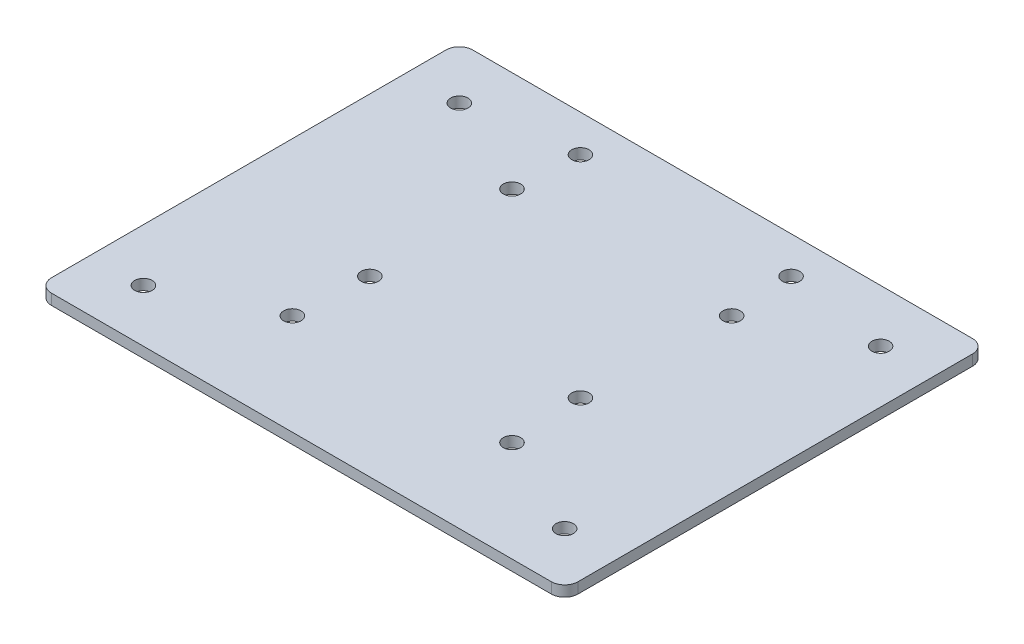
ISO-10303-21;
HEADER;
FILE_DESCRIPTION(('STEP AP214'),'2;1');
FILE_NAME('part.step','',(''),(''),'','','');
FILE_SCHEMA(('AUTOMOTIVE_DESIGN { 1 0 10303 214 1 1 1 1 }'));
ENDSEC;
DATA;
#1=APPLICATION_CONTEXT('core data for automotive mechanical design processes');
#2=APPLICATION_PROTOCOL_DEFINITION('international standard','automotive_design',2000,#1);
#3=PRODUCT_CONTEXT('',#1,'mechanical');
#4=PRODUCT('Part','Part','',(#3));
#5=PRODUCT_RELATED_PRODUCT_CATEGORY('part','',(#4));
#6=PRODUCT_DEFINITION_FORMATION('','',#4);
#7=PRODUCT_DEFINITION_CONTEXT('part definition',#1,'design');
#8=PRODUCT_DEFINITION('design','',#6,#7);
#9=PRODUCT_DEFINITION_SHAPE('','',#8);
#10=(LENGTH_UNIT() NAMED_UNIT(*) SI_UNIT(.MILLI.,.METRE.));
#11=(NAMED_UNIT(*) PLANE_ANGLE_UNIT() SI_UNIT($,.RADIAN.));
#12=(NAMED_UNIT(*) SI_UNIT($,.STERADIAN.) SOLID_ANGLE_UNIT());
#13=UNCERTAINTY_MEASURE_WITH_UNIT(LENGTH_MEASURE(1.E-05),#10,'distance_accuracy_value','');
#14=(GEOMETRIC_REPRESENTATION_CONTEXT(3) GLOBAL_UNCERTAINTY_ASSIGNED_CONTEXT((#13)) GLOBAL_UNIT_ASSIGNED_CONTEXT((#10,
#11,#12)) REPRESENTATION_CONTEXT('',''));
#15=CARTESIAN_POINT('',(0.,0.,0.));
#16=DIRECTION('',(0.,0.,1.));
#17=DIRECTION('',(1.,0.,0.));
#18=AXIS2_PLACEMENT_3D('',#15,#16,#17);
#19=CARTESIAN_POINT('',(0.,2.032,0.));
#20=DIRECTION('',(0.,1.,0.));
#21=DIRECTION('',(0.,0.,1.));
#22=AXIS2_PLACEMENT_3D('',#19,#20,#21);
#23=PLANE('',#22);
#24=CARTESIAN_POINT('',(-17.3902622899012,2.032,32.390262289901));
#25=DIRECTION('',(0.,1.,0.));
#26=DIRECTION('',(0.,0.,1.));
#27=AXIS2_PLACEMENT_3D('',#24,#25,#26);
#28=CIRCLE('',#27,1.651);
#29=CARTESIAN_POINT('',(-17.3902622899012,2.032,34.041262289901));
#30=VERTEX_POINT('',#29);
#31=EDGE_CURVE('E245',#30,#30,#28,.T.);
#32=ORIENTED_EDGE('',*,*,#31,.F.);
#33=EDGE_LOOP('',(#32));
#34=FACE_BOUND('',#33,.T.);
#35=CARTESIAN_POINT('',(43.4693877551021,2.032,41.530612244898));
#36=DIRECTION('',(0.,1.,0.));
#37=DIRECTION('',(0.,0.,-1.));
#38=AXIS2_PLACEMENT_3D('',#35,#36,#37);
#39=CIRCLE('',#38,1.651);
#40=CARTESIAN_POINT('',(43.4693877551021,2.032,39.879612244898));
#41=VERTEX_POINT('',#40);
#42=EDGE_CURVE('E233',#41,#41,#39,.T.);
#43=ORIENTED_EDGE('',*,*,#42,.F.);
#44=EDGE_LOOP('',(#43));
#45=FACE_BOUND('',#44,.T.);
#46=CARTESIAN_POINT('',(-17.390262289901,2.032,-9.32903780010529));
#47=DIRECTION('',(0.,1.,0.));
#48=DIRECTION('',(0.,0.,1.));
#49=AXIS2_PLACEMENT_3D('',#46,#47,#48);
#50=CIRCLE('',#49,1.651);
#51=CARTESIAN_POINT('',(-17.390262289901,2.032,-7.67803780010529));
#52=VERTEX_POINT('',#51);
#53=EDGE_CURVE('E221',#52,#52,#50,.T.);
#54=ORIENTED_EDGE('',*,*,#53,.F.);
#55=EDGE_LOOP('',(#54));
#56=FACE_BOUND('',#55,.T.);
#57=CARTESIAN_POINT('',(-16.5306122448979,2.032,18.530612244898));
#58=DIRECTION('',(0.,1.,0.));
#59=DIRECTION('',(0.,0.,1.));
#60=AXIS2_PLACEMENT_3D('',#57,#58,#59);
#61=CIRCLE('',#60,1.651);
#62=CARTESIAN_POINT('',(-16.5306122448979,2.032,20.181612244898));
#63=VERTEX_POINT('',#62);
#64=EDGE_CURVE('E209',#63,#63,#61,.T.);
#65=ORIENTED_EDGE('',*,*,#64,.F.);
#66=EDGE_LOOP('',(#65));
#67=FACE_BOUND('',#66,.T.);
#68=CARTESIAN_POINT('',(-16.5306122448979,2.032,-21.469387755102));
#69=DIRECTION('',(0.,1.,0.));
#70=DIRECTION('',(0.,0.,1.));
#71=AXIS2_PLACEMENT_3D('',#68,#69,#70);
#72=CIRCLE('',#71,1.651);
#73=CARTESIAN_POINT('',(-16.5306122448979,2.032,-19.818387755102));
#74=VERTEX_POINT('',#73);
#75=EDGE_CURVE('E197',#74,#74,#72,.T.);
#76=ORIENTED_EDGE('',*,*,#75,.F.);
#77=EDGE_LOOP('',(#76));
#78=FACE_BOUND('',#77,.T.);
#79=CARTESIAN_POINT('',(-36.5306122448979,2.032,-18.469387755102));
#80=DIRECTION('',(0.,1.,0.));
#81=DIRECTION('',(0.,0.,1.));
#82=AXIS2_PLACEMENT_3D('',#79,#80,#81);
#83=CIRCLE('',#82,1.651);
#84=CARTESIAN_POINT('',(-36.5306122448979,2.032,-16.818387755102));
#85=VERTEX_POINT('',#84);
#86=EDGE_CURVE('E139',#85,#85,#83,.T.);
#87=ORIENTED_EDGE('',*,*,#86,.F.);
#88=EDGE_LOOP('',(#87));
#89=FACE_BOUND('',#88,.T.);
#90=DIRECTION('',(-1.,0.,0.));
#91=VECTOR('',#90,1.);
#92=CARTESIAN_POINT('',(-46.5306122448979,2.032,-28.469387755102));
#93=LINE('',#92,#91);
#94=CARTESIAN_POINT('',(50.9293877551021,2.032,-28.469387755102));
#95=VERTEX_POINT('',#94);
#96=CARTESIAN_POINT('',(-43.9906122448979,2.032,-28.469387755102));
#97=VERTEX_POINT('',#96);
#98=EDGE_CURVE('E128',#95,#97,#93,.T.);
#99=ORIENTED_EDGE('',*,*,#98,.T.);
#100=CARTESIAN_POINT('',(-43.9906122448979,2.032,-25.929387755102));
#101=DIRECTION('',(0.,1.,0.));
#102=DIRECTION('',(0.,0.,1.));
#103=AXIS2_PLACEMENT_3D('',#100,#101,#102);
#104=CIRCLE('',#103,2.54);
#105=CARTESIAN_POINT('',(-46.5306122448979,2.032,-25.929387755102));
#106=VERTEX_POINT('',#105);
#107=EDGE_CURVE('E165',#97,#106,#104,.T.);
#108=ORIENTED_EDGE('',*,*,#107,.T.);
#109=DIRECTION('',(0.,0.,1.));
#110=VECTOR('',#109,1.);
#111=CARTESIAN_POINT('',(-46.5306122448979,2.032,-28.469387755102));
#112=LINE('',#111,#110);
#113=CARTESIAN_POINT('',(-46.5306122448979,2.032,48.990612244898));
#114=VERTEX_POINT('',#113);
#115=EDGE_CURVE('E144',#106,#114,#112,.T.);
#116=ORIENTED_EDGE('',*,*,#115,.T.);
#117=CARTESIAN_POINT('',(-43.9906122448979,2.032,48.990612244898));
#118=DIRECTION('',(0.,1.,0.));
#119=DIRECTION('',(0.,0.,1.));
#120=AXIS2_PLACEMENT_3D('',#117,#118,#119);
#121=CIRCLE('',#120,2.54);
#122=CARTESIAN_POINT('',(-43.9906122448979,2.032,51.530612244898));
#123=VERTEX_POINT('',#122);
#124=EDGE_CURVE('E147',#114,#123,#121,.T.);
#125=ORIENTED_EDGE('',*,*,#124,.T.);
#126=DIRECTION('',(1.,0.,0.));
#127=VECTOR('',#126,1.);
#128=CARTESIAN_POINT('',(-46.5306122448979,2.032,51.530612244898));
#129=LINE('',#128,#127);
#130=CARTESIAN_POINT('',(50.9293877551021,2.032,51.530612244898));
#131=VERTEX_POINT('',#130);
#132=EDGE_CURVE('E127',#123,#131,#129,.T.);
#133=ORIENTED_EDGE('',*,*,#132,.T.);
#134=CARTESIAN_POINT('',(50.9293877551021,2.032,48.990612244898));
#135=DIRECTION('',(0.,1.,0.));
#136=DIRECTION('',(0.,0.,1.));
#137=AXIS2_PLACEMENT_3D('',#134,#135,#136);
#138=CIRCLE('',#137,2.54);
#139=CARTESIAN_POINT('',(53.4693877551021,2.032,48.990612244898));
#140=VERTEX_POINT('',#139);
#141=EDGE_CURVE('E65',#131,#140,#138,.T.);
#142=ORIENTED_EDGE('',*,*,#141,.T.);
#143=DIRECTION('',(0.,0.,-1.));
#144=VECTOR('',#143,1.);
#145=CARTESIAN_POINT('',(53.4693877551021,2.032,-28.469387755102));
#146=LINE('',#145,#144);
#147=CARTESIAN_POINT('',(53.4693877551021,2.032,-25.929387755102));
#148=VERTEX_POINT('',#147);
#149=EDGE_CURVE('E171',#140,#148,#146,.T.);
#150=ORIENTED_EDGE('',*,*,#149,.T.);
#151=CARTESIAN_POINT('',(50.9293877551021,2.032,-25.929387755102));
#152=DIRECTION('',(0.,1.,0.));
#153=DIRECTION('',(0.,0.,1.));
#154=AXIS2_PLACEMENT_3D('',#151,#152,#153);
#155=CIRCLE('',#154,2.54);
#156=EDGE_CURVE('E163',#148,#95,#155,.T.);
#157=ORIENTED_EDGE('',*,*,#156,.T.);
#158=EDGE_LOOP('',(#99,#108,#116,#125,#133,#142,#150,#157));
#159=FACE_BOUND('',#158,.T.);
#160=CARTESIAN_POINT('',(-36.5306122448979,2.032,41.530612244898));
#161=DIRECTION('',(0.,1.,0.));
#162=DIRECTION('',(0.,0.,1.));
#163=AXIS2_PLACEMENT_3D('',#160,#161,#162);
#164=CIRCLE('',#163,1.651);
#165=CARTESIAN_POINT('',(-36.5306122448979,2.032,43.181612244898));
#166=VERTEX_POINT('',#165);
#167=EDGE_CURVE('E191',#166,#166,#164,.T.);
#168=ORIENTED_EDGE('',*,*,#167,.F.);
#169=EDGE_LOOP('',(#168));
#170=FACE_BOUND('',#169,.T.);
#171=CARTESIAN_POINT('',(23.4693877551021,2.032,-21.469387755102));
#172=DIRECTION('',(0.,1.,0.));
#173=DIRECTION('',(0.,0.,1.));
#174=AXIS2_PLACEMENT_3D('',#171,#172,#173);
#175=CIRCLE('',#174,1.651);
#176=CARTESIAN_POINT('',(23.4693877551021,2.032,-19.818387755102));
#177=VERTEX_POINT('',#176);
#178=EDGE_CURVE('E203',#177,#177,#175,.T.);
#179=ORIENTED_EDGE('',*,*,#178,.F.);
#180=EDGE_LOOP('',(#179));
#181=FACE_BOUND('',#180,.T.);
#182=CARTESIAN_POINT('',(23.4693877551021,2.032,18.530612244898));
#183=DIRECTION('',(0.,1.,0.));
#184=DIRECTION('',(0.,0.,1.));
#185=AXIS2_PLACEMENT_3D('',#182,#183,#184);
#186=CIRCLE('',#185,1.651);
#187=CARTESIAN_POINT('',(23.4693877551021,2.032,20.181612244898));
#188=VERTEX_POINT('',#187);
#189=EDGE_CURVE('E215',#188,#188,#186,.T.);
#190=ORIENTED_EDGE('',*,*,#189,.F.);
#191=EDGE_LOOP('',(#190));
#192=FACE_BOUND('',#191,.T.);
#193=CARTESIAN_POINT('',(24.3290378001052,2.032,-9.32903780010523));
#194=DIRECTION('',(0.,1.,0.));
#195=DIRECTION('',(0.,0.,1.));
#196=AXIS2_PLACEMENT_3D('',#193,#194,#195);
#197=CIRCLE('',#196,1.651);
#198=CARTESIAN_POINT('',(24.3290378001052,2.032,-7.67803780010523));
#199=VERTEX_POINT('',#198);
#200=EDGE_CURVE('E227',#199,#199,#197,.T.);
#201=ORIENTED_EDGE('',*,*,#200,.F.);
#202=EDGE_LOOP('',(#201));
#203=FACE_BOUND('',#202,.T.);
#204=CARTESIAN_POINT('',(43.4693877551021,2.032,-18.469387755102));
#205=DIRECTION('',(0.,1.,0.));
#206=DIRECTION('',(0.,0.,-1.));
#207=AXIS2_PLACEMENT_3D('',#204,#205,#206);
#208=CIRCLE('',#207,1.651);
#209=CARTESIAN_POINT('',(43.4693877551021,2.032,-20.120387755102));
#210=VERTEX_POINT('',#209);
#211=EDGE_CURVE('E239',#210,#210,#208,.T.);
#212=ORIENTED_EDGE('',*,*,#211,.F.);
#213=EDGE_LOOP('',(#212));
#214=FACE_BOUND('',#213,.T.);
#215=CARTESIAN_POINT('',(24.3290378001053,2.032,32.3902622899011));
#216=DIRECTION('',(0.,1.,0.));
#217=DIRECTION('',(0.,0.,1.));
#218=AXIS2_PLACEMENT_3D('',#215,#216,#217);
#219=CIRCLE('',#218,1.65100000000001);
#220=CARTESIAN_POINT('',(24.3290378001053,2.032,34.0412622899011));
#221=VERTEX_POINT('',#220);
#222=EDGE_CURVE('E251',#221,#221,#219,.T.);
#223=ORIENTED_EDGE('',*,*,#222,.F.);
#224=EDGE_LOOP('',(#223));
#225=FACE_BOUND('',#224,.T.);
#226=ADVANCED_FACE('F44',(#34,#45,#56,#67,#78,#89,#159,#170,#181,#192,#203,#214,#225),#23,.T.);
#227=CARTESIAN_POINT('',(0.,0.,0.));
#228=DIRECTION('',(0.,1.,0.));
#229=DIRECTION('',(0.,0.,1.));
#230=AXIS2_PLACEMENT_3D('',#227,#228,#229);
#231=PLANE('',#230);
#232=DIRECTION('',(0.,0.,1.));
#233=VECTOR('',#232,1.);
#234=CARTESIAN_POINT('',(-46.5306122448979,0.,-28.469387755102));
#235=LINE('',#234,#233);
#236=CARTESIAN_POINT('',(-46.5306122448979,0.,-25.929387755102));
#237=VERTEX_POINT('',#236);
#238=CARTESIAN_POINT('',(-46.5306122448979,0.,48.990612244898));
#239=VERTEX_POINT('',#238);
#240=EDGE_CURVE('E135',#237,#239,#235,.T.);
#241=ORIENTED_EDGE('',*,*,#240,.F.);
#242=CARTESIAN_POINT('',(-43.9906122448979,0.,-25.929387755102));
#243=DIRECTION('',(0.,1.,0.));
#244=DIRECTION('',(0.,0.,1.));
#245=AXIS2_PLACEMENT_3D('',#242,#243,#244);
#246=CIRCLE('',#245,2.54);
#247=CARTESIAN_POINT('',(-43.9906122448979,0.,-28.469387755102));
#248=VERTEX_POINT('',#247);
#249=EDGE_CURVE('E155',#237,#248,#246,.F.);
#250=ORIENTED_EDGE('',*,*,#249,.T.);
#251=DIRECTION('',(-1.,0.,0.));
#252=VECTOR('',#251,1.);
#253=CARTESIAN_POINT('',(-46.5306122448979,0.,-28.469387755102));
#254=LINE('',#253,#252);
#255=CARTESIAN_POINT('',(50.9293877551021,0.,-28.469387755102));
#256=VERTEX_POINT('',#255);
#257=EDGE_CURVE('E137',#256,#248,#254,.T.);
#258=ORIENTED_EDGE('',*,*,#257,.F.);
#259=CARTESIAN_POINT('',(50.9293877551021,0.,-25.929387755102));
#260=DIRECTION('',(0.,1.,0.));
#261=DIRECTION('',(0.,0.,1.));
#262=AXIS2_PLACEMENT_3D('',#259,#260,#261);
#263=CIRCLE('',#262,2.54);
#264=CARTESIAN_POINT('',(53.4693877551021,0.,-25.929387755102));
#265=VERTEX_POINT('',#264);
#266=EDGE_CURVE('E153',#256,#265,#263,.F.);
#267=ORIENTED_EDGE('',*,*,#266,.T.);
#268=DIRECTION('',(0.,0.,-1.));
#269=VECTOR('',#268,1.);
#270=CARTESIAN_POINT('',(53.4693877551021,0.,-28.469387755102));
#271=LINE('',#270,#269);
#272=CARTESIAN_POINT('',(53.4693877551021,0.,48.990612244898));
#273=VERTEX_POINT('',#272);
#274=EDGE_CURVE('E134',#273,#265,#271,.T.);
#275=ORIENTED_EDGE('',*,*,#274,.F.);
#276=CARTESIAN_POINT('',(50.9293877551021,0.,48.990612244898));
#277=DIRECTION('',(0.,1.,0.));
#278=DIRECTION('',(0.,0.,1.));
#279=AXIS2_PLACEMENT_3D('',#276,#277,#278);
#280=CIRCLE('',#279,2.54);
#281=CARTESIAN_POINT('',(50.9293877551021,0.,51.530612244898));
#282=VERTEX_POINT('',#281);
#283=EDGE_CURVE('E133',#273,#282,#280,.F.);
#284=ORIENTED_EDGE('',*,*,#283,.T.);
#285=DIRECTION('',(1.,0.,0.));
#286=VECTOR('',#285,1.);
#287=CARTESIAN_POINT('',(-46.5306122448979,0.,51.530612244898));
#288=LINE('',#287,#286);
#289=CARTESIAN_POINT('',(-43.9906122448979,0.,51.530612244898));
#290=VERTEX_POINT('',#289);
#291=EDGE_CURVE('E125',#290,#282,#288,.T.);
#292=ORIENTED_EDGE('',*,*,#291,.F.);
#293=CARTESIAN_POINT('',(-43.9906122448979,0.,48.990612244898));
#294=DIRECTION('',(0.,1.,0.));
#295=DIRECTION('',(0.,0.,1.));
#296=AXIS2_PLACEMENT_3D('',#293,#294,#295);
#297=CIRCLE('',#296,2.54);
#298=EDGE_CURVE('E110',#290,#239,#297,.F.);
#299=ORIENTED_EDGE('',*,*,#298,.T.);
#300=EDGE_LOOP('',(#241,#250,#258,#267,#275,#284,#292,#299));
#301=FACE_BOUND('',#300,.T.);
#302=CARTESIAN_POINT('',(-36.5306122448979,0.,-18.469387755102));
#303=DIRECTION('',(0.,1.,0.));
#304=DIRECTION('',(0.,0.,1.));
#305=AXIS2_PLACEMENT_3D('',#302,#303,#304);
#306=CIRCLE('',#305,1.651);
#307=CARTESIAN_POINT('',(-36.5306122448979,0.,-16.818387755102));
#308=VERTEX_POINT('',#307);
#309=EDGE_CURVE('E188',#308,#308,#306,.T.);
#310=ORIENTED_EDGE('',*,*,#309,.T.);
#311=EDGE_LOOP('',(#310));
#312=FACE_BOUND('',#311,.T.);
#313=CARTESIAN_POINT('',(-36.5306122448979,0.,41.530612244898));
#314=DIRECTION('',(0.,1.,0.));
#315=DIRECTION('',(0.,0.,1.));
#316=AXIS2_PLACEMENT_3D('',#313,#314,#315);
#317=CIRCLE('',#316,1.651);
#318=CARTESIAN_POINT('',(-36.5306122448979,0.,43.181612244898));
#319=VERTEX_POINT('',#318);
#320=EDGE_CURVE('E194',#319,#319,#317,.T.);
#321=ORIENTED_EDGE('',*,*,#320,.T.);
#322=EDGE_LOOP('',(#321));
#323=FACE_BOUND('',#322,.T.);
#324=CARTESIAN_POINT('',(-16.5306122448979,0.,-21.469387755102));
#325=DIRECTION('',(0.,1.,0.));
#326=DIRECTION('',(0.,0.,1.));
#327=AXIS2_PLACEMENT_3D('',#324,#325,#326);
#328=CIRCLE('',#327,1.651);
#329=CARTESIAN_POINT('',(-16.5306122448979,0.,-19.818387755102));
#330=VERTEX_POINT('',#329);
#331=EDGE_CURVE('E200',#330,#330,#328,.T.);
#332=ORIENTED_EDGE('',*,*,#331,.T.);
#333=EDGE_LOOP('',(#332));
#334=FACE_BOUND('',#333,.T.);
#335=CARTESIAN_POINT('',(23.4693877551021,0.,-21.469387755102));
#336=DIRECTION('',(0.,1.,0.));
#337=DIRECTION('',(0.,0.,1.));
#338=AXIS2_PLACEMENT_3D('',#335,#336,#337);
#339=CIRCLE('',#338,1.651);
#340=CARTESIAN_POINT('',(23.4693877551021,0.,-19.818387755102));
#341=VERTEX_POINT('',#340);
#342=EDGE_CURVE('E206',#341,#341,#339,.T.);
#343=ORIENTED_EDGE('',*,*,#342,.T.);
#344=EDGE_LOOP('',(#343));
#345=FACE_BOUND('',#344,.T.);
#346=CARTESIAN_POINT('',(-16.5306122448979,0.,18.530612244898));
#347=DIRECTION('',(0.,1.,0.));
#348=DIRECTION('',(0.,0.,1.));
#349=AXIS2_PLACEMENT_3D('',#346,#347,#348);
#350=CIRCLE('',#349,1.651);
#351=CARTESIAN_POINT('',(-16.5306122448979,0.,20.181612244898));
#352=VERTEX_POINT('',#351);
#353=EDGE_CURVE('E212',#352,#352,#350,.T.);
#354=ORIENTED_EDGE('',*,*,#353,.T.);
#355=EDGE_LOOP('',(#354));
#356=FACE_BOUND('',#355,.T.);
#357=CARTESIAN_POINT('',(23.4693877551021,0.,18.530612244898));
#358=DIRECTION('',(0.,1.,0.));
#359=DIRECTION('',(0.,0.,1.));
#360=AXIS2_PLACEMENT_3D('',#357,#358,#359);
#361=CIRCLE('',#360,1.651);
#362=CARTESIAN_POINT('',(23.4693877551021,0.,20.181612244898));
#363=VERTEX_POINT('',#362);
#364=EDGE_CURVE('E218',#363,#363,#361,.T.);
#365=ORIENTED_EDGE('',*,*,#364,.T.);
#366=EDGE_LOOP('',(#365));
#367=FACE_BOUND('',#366,.T.);
#368=CARTESIAN_POINT('',(-17.390262289901,0.,-9.32903780010529));
#369=DIRECTION('',(0.,1.,0.));
#370=DIRECTION('',(0.,0.,1.));
#371=AXIS2_PLACEMENT_3D('',#368,#369,#370);
#372=CIRCLE('',#371,1.651);
#373=CARTESIAN_POINT('',(-17.390262289901,0.,-7.67803780010529));
#374=VERTEX_POINT('',#373);
#375=EDGE_CURVE('E224',#374,#374,#372,.T.);
#376=ORIENTED_EDGE('',*,*,#375,.T.);
#377=EDGE_LOOP('',(#376));
#378=FACE_BOUND('',#377,.T.);
#379=CARTESIAN_POINT('',(24.3290378001052,0.,-9.32903780010523));
#380=DIRECTION('',(0.,1.,0.));
#381=DIRECTION('',(0.,0.,1.));
#382=AXIS2_PLACEMENT_3D('',#379,#380,#381);
#383=CIRCLE('',#382,1.651);
#384=CARTESIAN_POINT('',(24.3290378001052,0.,-7.67803780010523));
#385=VERTEX_POINT('',#384);
#386=EDGE_CURVE('E230',#385,#385,#383,.T.);
#387=ORIENTED_EDGE('',*,*,#386,.T.);
#388=EDGE_LOOP('',(#387));
#389=FACE_BOUND('',#388,.T.);
#390=CARTESIAN_POINT('',(43.4693877551021,0.,41.530612244898));
#391=DIRECTION('',(0.,1.,0.));
#392=DIRECTION('',(0.,0.,-1.));
#393=AXIS2_PLACEMENT_3D('',#390,#391,#392);
#394=CIRCLE('',#393,1.651);
#395=CARTESIAN_POINT('',(43.4693877551021,0.,39.879612244898));
#396=VERTEX_POINT('',#395);
#397=EDGE_CURVE('E236',#396,#396,#394,.T.);
#398=ORIENTED_EDGE('',*,*,#397,.T.);
#399=EDGE_LOOP('',(#398));
#400=FACE_BOUND('',#399,.T.);
#401=CARTESIAN_POINT('',(43.4693877551021,0.,-18.469387755102));
#402=DIRECTION('',(0.,1.,0.));
#403=DIRECTION('',(0.,0.,-1.));
#404=AXIS2_PLACEMENT_3D('',#401,#402,#403);
#405=CIRCLE('',#404,1.651);
#406=CARTESIAN_POINT('',(43.4693877551021,0.,-20.120387755102));
#407=VERTEX_POINT('',#406);
#408=EDGE_CURVE('E242',#407,#407,#405,.T.);
#409=ORIENTED_EDGE('',*,*,#408,.T.);
#410=EDGE_LOOP('',(#409));
#411=FACE_BOUND('',#410,.T.);
#412=CARTESIAN_POINT('',(-17.3902622899012,0.,32.390262289901));
#413=DIRECTION('',(0.,1.,0.));
#414=DIRECTION('',(0.,0.,1.));
#415=AXIS2_PLACEMENT_3D('',#412,#413,#414);
#416=CIRCLE('',#415,1.651);
#417=CARTESIAN_POINT('',(-17.3902622899012,0.,34.041262289901));
#418=VERTEX_POINT('',#417);
#419=EDGE_CURVE('E248',#418,#418,#416,.T.);
#420=ORIENTED_EDGE('',*,*,#419,.T.);
#421=EDGE_LOOP('',(#420));
#422=FACE_BOUND('',#421,.T.);
#423=CARTESIAN_POINT('',(24.3290378001053,0.,32.3902622899011));
#424=DIRECTION('',(0.,1.,0.));
#425=DIRECTION('',(0.,0.,1.));
#426=AXIS2_PLACEMENT_3D('',#423,#424,#425);
#427=CIRCLE('',#426,1.65100000000001);
#428=CARTESIAN_POINT('',(24.3290378001053,0.,34.0412622899011));
#429=VERTEX_POINT('',#428);
#430=EDGE_CURVE('E254',#429,#429,#427,.T.);
#431=ORIENTED_EDGE('',*,*,#430,.T.);
#432=EDGE_LOOP('',(#431));
#433=FACE_BOUND('',#432,.T.);
#434=ADVANCED_FACE('F130',(#301,#312,#323,#334,#345,#356,#367,#378,#389,#400,#411,#422,#433),
#231,.F.);
#435=CARTESIAN_POINT('',(-46.5306122448979,2.032,-28.469387755102));
#436=DIRECTION('',(1.,0.,0.));
#437=DIRECTION('',(0.,0.,-1.));
#438=AXIS2_PLACEMENT_3D('',#435,#436,#437);
#439=PLANE('',#438);
#440=ORIENTED_EDGE('',*,*,#115,.F.);
#441=DIRECTION('',(0.,-1.,0.));
#442=VECTOR('',#441,1.);
#443=CARTESIAN_POINT('',(-46.5306122448979,2.032,-25.929387755102));
#444=LINE('',#443,#442);
#445=EDGE_CURVE('E149',#106,#237,#444,.T.);
#446=ORIENTED_EDGE('',*,*,#445,.T.);
#447=ORIENTED_EDGE('',*,*,#240,.T.);
#448=DIRECTION('',(0.,-1.,0.));
#449=VECTOR('',#448,1.);
#450=CARTESIAN_POINT('',(-46.5306122448979,2.032,48.990612244898));
#451=LINE('',#450,#449);
#452=EDGE_CURVE('E116',#239,#114,#451,.F.);
#453=ORIENTED_EDGE('',*,*,#452,.T.);
#454=EDGE_LOOP('',(#440,#446,#447,#453));
#455=FACE_BOUND('',#454,.T.);
#456=ADVANCED_FACE('F269',(#455),#439,.F.);
#457=CARTESIAN_POINT('',(-46.5306122448979,2.032,51.530612244898));
#458=DIRECTION('',(0.,0.,-1.));
#459=DIRECTION('',(-1.,0.,0.));
#460=AXIS2_PLACEMENT_3D('',#457,#458,#459);
#461=PLANE('',#460);
#462=ORIENTED_EDGE('',*,*,#291,.T.);
#463=DIRECTION('',(0.,-1.,0.));
#464=VECTOR('',#463,1.);
#465=CARTESIAN_POINT('',(50.9293877551021,2.032,51.530612244898));
#466=LINE('',#465,#464);
#467=EDGE_CURVE('E13',#282,#131,#466,.F.);
#468=ORIENTED_EDGE('',*,*,#467,.T.);
#469=ORIENTED_EDGE('',*,*,#132,.F.);
#470=DIRECTION('',(0.,-1.,0.));
#471=VECTOR('',#470,1.);
#472=CARTESIAN_POINT('',(-43.9906122448979,2.032,51.530612244898));
#473=LINE('',#472,#471);
#474=EDGE_CURVE('E114',#123,#290,#473,.T.);
#475=ORIENTED_EDGE('',*,*,#474,.T.);
#476=EDGE_LOOP('',(#462,#468,#469,#475));
#477=FACE_BOUND('',#476,.T.);
#478=ADVANCED_FACE('F124',(#477),#461,.F.);
#479=CARTESIAN_POINT('',(53.4693877551021,2.032,-28.469387755102));
#480=DIRECTION('',(-1.,0.,0.));
#481=DIRECTION('',(0.,0.,1.));
#482=AXIS2_PLACEMENT_3D('',#479,#480,#481);
#483=PLANE('',#482);
#484=ORIENTED_EDGE('',*,*,#274,.T.);
#485=DIRECTION('',(0.,-1.,0.));
#486=VECTOR('',#485,1.);
#487=CARTESIAN_POINT('',(53.4693877551021,2.032,-25.929387755102));
#488=LINE('',#487,#486);
#489=EDGE_CURVE('E52',#265,#148,#488,.F.);
#490=ORIENTED_EDGE('',*,*,#489,.T.);
#491=ORIENTED_EDGE('',*,*,#149,.F.);
#492=DIRECTION('',(0.,-1.,0.));
#493=VECTOR('',#492,1.);
#494=CARTESIAN_POINT('',(53.4693877551021,2.032,48.990612244898));
#495=LINE('',#494,#493);
#496=EDGE_CURVE('E167',#140,#273,#495,.T.);
#497=ORIENTED_EDGE('',*,*,#496,.T.);
#498=EDGE_LOOP('',(#484,#490,#491,#497));
#499=FACE_BOUND('',#498,.T.);
#500=ADVANCED_FACE('F170',(#499),#483,.F.);
#501=CARTESIAN_POINT('',(-46.5306122448979,2.032,-28.469387755102));
#502=DIRECTION('',(0.,0.,1.));
#503=DIRECTION('',(1.,0.,0.));
#504=AXIS2_PLACEMENT_3D('',#501,#502,#503);
#505=PLANE('',#504);
#506=ORIENTED_EDGE('',*,*,#257,.T.);
#507=DIRECTION('',(0.,-1.,0.));
#508=VECTOR('',#507,1.);
#509=CARTESIAN_POINT('',(-43.9906122448979,2.032,-28.469387755102));
#510=LINE('',#509,#508);
#511=EDGE_CURVE('E160',#248,#97,#510,.F.);
#512=ORIENTED_EDGE('',*,*,#511,.T.);
#513=ORIENTED_EDGE('',*,*,#98,.F.);
#514=DIRECTION('',(0.,-1.,0.));
#515=VECTOR('',#514,1.);
#516=CARTESIAN_POINT('',(50.9293877551021,2.032,-28.469387755102));
#517=LINE('',#516,#515);
#518=EDGE_CURVE('E157',#95,#256,#517,.T.);
#519=ORIENTED_EDGE('',*,*,#518,.T.);
#520=EDGE_LOOP('',(#506,#512,#513,#519));
#521=FACE_BOUND('',#520,.T.);
#522=ADVANCED_FACE('F180',(#521),#505,.F.);
#523=CARTESIAN_POINT('',(-36.5306122448979,2.032,-18.469387755102));
#524=DIRECTION('',(0.,-1.,0.));
#525=DIRECTION('',(0.,0.,-1.));
#526=AXIS2_PLACEMENT_3D('',#523,#524,#525);
#527=CYLINDRICAL_SURFACE('',#526,1.651);
#528=ORIENTED_EDGE('',*,*,#86,.T.);
#529=EDGE_LOOP('',(#528));
#530=FACE_BOUND('',#529,.T.);
#531=ORIENTED_EDGE('',*,*,#309,.F.);
#532=EDGE_LOOP('',(#531));
#533=FACE_BOUND('',#532,.T.);
#534=ADVANCED_FACE('F274',(#530,#533),#527,.F.);
#535=CARTESIAN_POINT('',(-36.5306122448979,2.032,41.530612244898));
#536=DIRECTION('',(0.,-1.,0.));
#537=DIRECTION('',(0.,0.,-1.));
#538=AXIS2_PLACEMENT_3D('',#535,#536,#537);
#539=CYLINDRICAL_SURFACE('',#538,1.651);
#540=ORIENTED_EDGE('',*,*,#167,.T.);
#541=EDGE_LOOP('',(#540));
#542=FACE_BOUND('',#541,.T.);
#543=ORIENTED_EDGE('',*,*,#320,.F.);
#544=EDGE_LOOP('',(#543));
#545=FACE_BOUND('',#544,.T.);
#546=ADVANCED_FACE('F355',(#542,#545),#539,.F.);
#547=CARTESIAN_POINT('',(-16.5306122448979,2.032,-21.469387755102));
#548=DIRECTION('',(0.,-1.,0.));
#549=DIRECTION('',(0.,0.,-1.));
#550=AXIS2_PLACEMENT_3D('',#547,#548,#549);
#551=CYLINDRICAL_SURFACE('',#550,1.651);
#552=ORIENTED_EDGE('',*,*,#75,.T.);
#553=EDGE_LOOP('',(#552));
#554=FACE_BOUND('',#553,.T.);
#555=ORIENTED_EDGE('',*,*,#331,.F.);
#556=EDGE_LOOP('',(#555));
#557=FACE_BOUND('',#556,.T.);
#558=ADVANCED_FACE('F352',(#554,#557),#551,.F.);
#559=CARTESIAN_POINT('',(23.4693877551021,2.032,-21.469387755102));
#560=DIRECTION('',(0.,-1.,0.));
#561=DIRECTION('',(0.,0.,-1.));
#562=AXIS2_PLACEMENT_3D('',#559,#560,#561);
#563=CYLINDRICAL_SURFACE('',#562,1.651);
#564=ORIENTED_EDGE('',*,*,#178,.T.);
#565=EDGE_LOOP('',(#564));
#566=FACE_BOUND('',#565,.T.);
#567=ORIENTED_EDGE('',*,*,#342,.F.);
#568=EDGE_LOOP('',(#567));
#569=FACE_BOUND('',#568,.T.);
#570=ADVANCED_FACE('F348',(#566,#569),#563,.F.);
#571=CARTESIAN_POINT('',(-16.5306122448979,2.032,18.530612244898));
#572=DIRECTION('',(0.,-1.,0.));
#573=DIRECTION('',(0.,0.,-1.));
#574=AXIS2_PLACEMENT_3D('',#571,#572,#573);
#575=CYLINDRICAL_SURFACE('',#574,1.651);
#576=ORIENTED_EDGE('',*,*,#64,.T.);
#577=EDGE_LOOP('',(#576));
#578=FACE_BOUND('',#577,.T.);
#579=ORIENTED_EDGE('',*,*,#353,.F.);
#580=EDGE_LOOP('',(#579));
#581=FACE_BOUND('',#580,.T.);
#582=ADVANCED_FACE('F344',(#578,#581),#575,.F.);
#583=CARTESIAN_POINT('',(23.4693877551021,2.032,18.530612244898));
#584=DIRECTION('',(0.,-1.,0.));
#585=DIRECTION('',(0.,0.,-1.));
#586=AXIS2_PLACEMENT_3D('',#583,#584,#585);
#587=CYLINDRICAL_SURFACE('',#586,1.651);
#588=ORIENTED_EDGE('',*,*,#189,.T.);
#589=EDGE_LOOP('',(#588));
#590=FACE_BOUND('',#589,.T.);
#591=ORIENTED_EDGE('',*,*,#364,.F.);
#592=EDGE_LOOP('',(#591));
#593=FACE_BOUND('',#592,.T.);
#594=ADVANCED_FACE('F340',(#590,#593),#587,.F.);
#595=CARTESIAN_POINT('',(-17.390262289901,2.032,-9.32903780010529));
#596=DIRECTION('',(0.,-1.,0.));
#597=DIRECTION('',(0.,0.,-1.));
#598=AXIS2_PLACEMENT_3D('',#595,#596,#597);
#599=CYLINDRICAL_SURFACE('',#598,1.651);
#600=ORIENTED_EDGE('',*,*,#53,.T.);
#601=EDGE_LOOP('',(#600));
#602=FACE_BOUND('',#601,.T.);
#603=ORIENTED_EDGE('',*,*,#375,.F.);
#604=EDGE_LOOP('',(#603));
#605=FACE_BOUND('',#604,.T.);
#606=ADVANCED_FACE('F336',(#602,#605),#599,.F.);
#607=CARTESIAN_POINT('',(24.3290378001052,2.032,-9.32903780010523));
#608=DIRECTION('',(0.,-1.,0.));
#609=DIRECTION('',(0.,0.,-1.));
#610=AXIS2_PLACEMENT_3D('',#607,#608,#609);
#611=CYLINDRICAL_SURFACE('',#610,1.651);
#612=ORIENTED_EDGE('',*,*,#200,.T.);
#613=EDGE_LOOP('',(#612));
#614=FACE_BOUND('',#613,.T.);
#615=ORIENTED_EDGE('',*,*,#386,.F.);
#616=EDGE_LOOP('',(#615));
#617=FACE_BOUND('',#616,.T.);
#618=ADVANCED_FACE('F332',(#614,#617),#611,.F.);
#619=CARTESIAN_POINT('',(43.4693877551021,2.032,41.530612244898));
#620=DIRECTION('',(0.,-1.,0.));
#621=DIRECTION('',(0.,0.,-1.));
#622=AXIS2_PLACEMENT_3D('',#619,#620,#621);
#623=CYLINDRICAL_SURFACE('',#622,1.651);
#624=ORIENTED_EDGE('',*,*,#42,.T.);
#625=EDGE_LOOP('',(#624));
#626=FACE_BOUND('',#625,.T.);
#627=ORIENTED_EDGE('',*,*,#397,.F.);
#628=EDGE_LOOP('',(#627));
#629=FACE_BOUND('',#628,.T.);
#630=ADVANCED_FACE('F314',(#626,#629),#623,.F.);
#631=CARTESIAN_POINT('',(43.4693877551021,2.032,-18.469387755102));
#632=DIRECTION('',(0.,-1.,0.));
#633=DIRECTION('',(0.,0.,-1.));
#634=AXIS2_PLACEMENT_3D('',#631,#632,#633);
#635=CYLINDRICAL_SURFACE('',#634,1.651);
#636=ORIENTED_EDGE('',*,*,#211,.T.);
#637=EDGE_LOOP('',(#636));
#638=FACE_BOUND('',#637,.T.);
#639=ORIENTED_EDGE('',*,*,#408,.F.);
#640=EDGE_LOOP('',(#639));
#641=FACE_BOUND('',#640,.T.);
#642=ADVANCED_FACE('F310',(#638,#641),#635,.F.);
#643=CARTESIAN_POINT('',(-17.3902622899012,2.032,32.390262289901));
#644=DIRECTION('',(0.,-1.,0.));
#645=DIRECTION('',(0.,0.,-1.));
#646=AXIS2_PLACEMENT_3D('',#643,#644,#645);
#647=CYLINDRICAL_SURFACE('',#646,1.651);
#648=ORIENTED_EDGE('',*,*,#31,.T.);
#649=EDGE_LOOP('',(#648));
#650=FACE_BOUND('',#649,.T.);
#651=ORIENTED_EDGE('',*,*,#419,.F.);
#652=EDGE_LOOP('',(#651));
#653=FACE_BOUND('',#652,.T.);
#654=ADVANCED_FACE('F313',(#650,#653),#647,.F.);
#655=CARTESIAN_POINT('',(24.3290378001053,2.032,32.3902622899011));
#656=DIRECTION('',(0.,-1.,0.));
#657=DIRECTION('',(0.,0.,-1.));
#658=AXIS2_PLACEMENT_3D('',#655,#656,#657);
#659=CYLINDRICAL_SURFACE('',#658,1.65100000000001);
#660=ORIENTED_EDGE('',*,*,#222,.T.);
#661=EDGE_LOOP('',(#660));
#662=FACE_BOUND('',#661,.T.);
#663=ORIENTED_EDGE('',*,*,#430,.F.);
#664=EDGE_LOOP('',(#663));
#665=FACE_BOUND('',#664,.T.);
#666=ADVANCED_FACE('F260',(#662,#665),#659,.F.);
#667=CARTESIAN_POINT('',(-43.9906122448979,2.032,48.990612244898));
#668=DIRECTION('',(0.,-1.,0.));
#669=DIRECTION('',(0.,0.,-1.));
#670=AXIS2_PLACEMENT_3D('',#667,#668,#669);
#671=CYLINDRICAL_SURFACE('',#670,2.54);
#672=ORIENTED_EDGE('',*,*,#124,.F.);
#673=ORIENTED_EDGE('',*,*,#452,.F.);
#674=ORIENTED_EDGE('',*,*,#298,.F.);
#675=ORIENTED_EDGE('',*,*,#474,.F.);
#676=EDGE_LOOP('',(#672,#673,#674,#675));
#677=FACE_BOUND('',#676,.T.);
#678=ADVANCED_FACE('F113',(#677),#671,.T.);
#679=CARTESIAN_POINT('',(-43.9906122448979,2.032,-25.929387755102));
#680=DIRECTION('',(0.,-1.,0.));
#681=DIRECTION('',(0.,0.,-1.));
#682=AXIS2_PLACEMENT_3D('',#679,#680,#681);
#683=CYLINDRICAL_SURFACE('',#682,2.54);
#684=ORIENTED_EDGE('',*,*,#107,.F.);
#685=ORIENTED_EDGE('',*,*,#511,.F.);
#686=ORIENTED_EDGE('',*,*,#249,.F.);
#687=ORIENTED_EDGE('',*,*,#445,.F.);
#688=EDGE_LOOP('',(#684,#685,#686,#687));
#689=FACE_BOUND('',#688,.T.);
#690=ADVANCED_FACE('F288',(#689),#683,.T.);
#691=CARTESIAN_POINT('',(50.9293877551021,2.032,-25.929387755102));
#692=DIRECTION('',(0.,-1.,0.));
#693=DIRECTION('',(0.,0.,-1.));
#694=AXIS2_PLACEMENT_3D('',#691,#692,#693);
#695=CYLINDRICAL_SURFACE('',#694,2.54);
#696=ORIENTED_EDGE('',*,*,#156,.F.);
#697=ORIENTED_EDGE('',*,*,#489,.F.);
#698=ORIENTED_EDGE('',*,*,#266,.F.);
#699=ORIENTED_EDGE('',*,*,#518,.F.);
#700=EDGE_LOOP('',(#696,#697,#698,#699));
#701=FACE_BOUND('',#700,.T.);
#702=ADVANCED_FACE('F177',(#701),#695,.T.);
#703=CARTESIAN_POINT('',(50.9293877551021,2.032,48.990612244898));
#704=DIRECTION('',(0.,-1.,0.));
#705=DIRECTION('',(0.,0.,-1.));
#706=AXIS2_PLACEMENT_3D('',#703,#704,#705);
#707=CYLINDRICAL_SURFACE('',#706,2.54);
#708=ORIENTED_EDGE('',*,*,#141,.F.);
#709=ORIENTED_EDGE('',*,*,#467,.F.);
#710=ORIENTED_EDGE('',*,*,#283,.F.);
#711=ORIENTED_EDGE('',*,*,#496,.F.);
#712=EDGE_LOOP('',(#708,#709,#710,#711));
#713=FACE_BOUND('',#712,.T.);
#714=ADVANCED_FACE('F46',(#713),#707,.T.);
#715=CLOSED_SHELL('',(#226,#434,#456,#478,#500,#522,#534,#546,#558,#570,#582,#594,#606,#618,
#630,#642,#654,#666,#678,#690,#702,#714));
#716=MANIFOLD_SOLID_BREP('B2',#715);
#717=ADVANCED_BREP_SHAPE_REPRESENTATION('',(#18,#716),#14);
#718=SHAPE_DEFINITION_REPRESENTATION(#9,#717);
ENDSEC;
END-ISO-10303-21;
